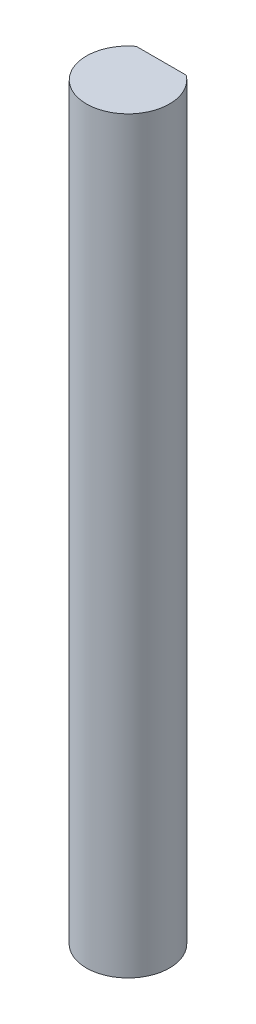
ISO-10303-21;
HEADER;
FILE_DESCRIPTION(('STEP AP214'),'2;1');
FILE_NAME('part.step','',(''),(''),'','','');
FILE_SCHEMA(('AUTOMOTIVE_DESIGN { 1 0 10303 214 1 1 1 1 }'));
ENDSEC;
DATA;
#1=APPLICATION_CONTEXT('core data for automotive mechanical design processes');
#2=APPLICATION_PROTOCOL_DEFINITION('international standard','automotive_design',2000,#1);
#3=PRODUCT_CONTEXT('',#1,'mechanical');
#4=PRODUCT('Part','Part','',(#3));
#5=PRODUCT_RELATED_PRODUCT_CATEGORY('part','',(#4));
#6=PRODUCT_DEFINITION_FORMATION('','',#4);
#7=PRODUCT_DEFINITION_CONTEXT('part definition',#1,'design');
#8=PRODUCT_DEFINITION('design','',#6,#7);
#9=PRODUCT_DEFINITION_SHAPE('','',#8);
#10=(LENGTH_UNIT() NAMED_UNIT(*) SI_UNIT(.MILLI.,.METRE.));
#11=(NAMED_UNIT(*) PLANE_ANGLE_UNIT() SI_UNIT($,.RADIAN.));
#12=(NAMED_UNIT(*) SI_UNIT($,.STERADIAN.) SOLID_ANGLE_UNIT());
#13=UNCERTAINTY_MEASURE_WITH_UNIT(LENGTH_MEASURE(1.E-05),#10,'distance_accuracy_value','');
#14=(GEOMETRIC_REPRESENTATION_CONTEXT(3) GLOBAL_UNCERTAINTY_ASSIGNED_CONTEXT((#13)) GLOBAL_UNIT_ASSIGNED_CONTEXT((#10,
#11,#12)) REPRESENTATION_CONTEXT('',''));
#15=CARTESIAN_POINT('',(0.,0.,0.));
#16=DIRECTION('',(0.,0.,1.));
#17=DIRECTION('',(1.,0.,0.));
#18=AXIS2_PLACEMENT_3D('',#15,#16,#17);
#19=CARTESIAN_POINT('',(0.,45.,0.));
#20=DIRECTION('',(0.,-1.,0.));
#21=DIRECTION('',(0.,0.,-1.));
#22=AXIS2_PLACEMENT_3D('',#19,#20,#21);
#23=CYLINDRICAL_SURFACE('',#22,2.5);
#24=CARTESIAN_POINT('',(0.,0.,0.));
#25=DIRECTION('',(0.,1.,0.));
#26=DIRECTION('',(0.,0.,1.));
#27=AXIS2_PLACEMENT_3D('',#24,#25,#26);
#28=CIRCLE('',#27,2.5);
#29=CARTESIAN_POINT('',(-1.5,0.,-2.));
#30=VERTEX_POINT('',#29);
#31=CARTESIAN_POINT('',(1.5,0.,-2.));
#32=VERTEX_POINT('',#31);
#33=EDGE_CURVE('E72',#30,#32,#28,.T.);
#34=ORIENTED_EDGE('',*,*,#33,.T.);
#35=DIRECTION('',(0.,-1.,0.));
#36=VECTOR('',#35,1.);
#37=CARTESIAN_POINT('',(1.5,45.,-2.));
#38=LINE('',#37,#36);
#39=CARTESIAN_POINT('',(1.5,45.,-2.));
#40=VERTEX_POINT('',#39);
#41=EDGE_CURVE('E11',#40,#32,#38,.T.);
#42=ORIENTED_EDGE('',*,*,#41,.F.);
#43=CARTESIAN_POINT('',(0.,45.,0.));
#44=DIRECTION('',(0.,1.,0.));
#45=DIRECTION('',(0.,0.,1.));
#46=AXIS2_PLACEMENT_3D('',#43,#44,#45);
#47=CIRCLE('',#46,2.5);
#48=CARTESIAN_POINT('',(-1.5,45.,-2.));
#49=VERTEX_POINT('',#48);
#50=EDGE_CURVE('E74',#49,#40,#47,.T.);
#51=ORIENTED_EDGE('',*,*,#50,.F.);
#52=DIRECTION('',(0.,-1.,0.));
#53=VECTOR('',#52,1.);
#54=CARTESIAN_POINT('',(-1.5,45.,-2.));
#55=LINE('',#54,#53);
#56=EDGE_CURVE('E56',#49,#30,#55,.T.);
#57=ORIENTED_EDGE('',*,*,#56,.T.);
#58=EDGE_LOOP('',(#34,#42,#51,#57));
#59=FACE_BOUND('',#58,.T.);
#60=ADVANCED_FACE('F47',(#59),#23,.T.);
#61=CARTESIAN_POINT('',(0.,45.,-2.));
#62=DIRECTION('',(0.,0.,-1.));
#63=DIRECTION('',(-1.,0.,0.));
#64=AXIS2_PLACEMENT_3D('',#61,#62,#63);
#65=PLANE('',#64);
#66=DIRECTION('',(1.,0.,0.));
#67=VECTOR('',#66,1.);
#68=CARTESIAN_POINT('',(0.,0.,-2.));
#69=LINE('',#68,#67);
#70=EDGE_CURVE('E80',#30,#32,#69,.T.);
#71=ORIENTED_EDGE('',*,*,#70,.F.);
#72=ORIENTED_EDGE('',*,*,#56,.F.);
#73=DIRECTION('',(1.,0.,0.));
#74=VECTOR('',#73,1.);
#75=CARTESIAN_POINT('',(0.,45.,-2.));
#76=LINE('',#75,#74);
#77=EDGE_CURVE('E77',#49,#40,#76,.T.);
#78=ORIENTED_EDGE('',*,*,#77,.T.);
#79=ORIENTED_EDGE('',*,*,#41,.T.);
#80=EDGE_LOOP('',(#71,#72,#78,#79));
#81=FACE_BOUND('',#80,.T.);
#82=ADVANCED_FACE('F83',(#81),#65,.T.);
#83=CARTESIAN_POINT('',(0.,45.,0.));
#84=DIRECTION('',(0.,1.,0.));
#85=DIRECTION('',(0.,0.,1.));
#86=AXIS2_PLACEMENT_3D('',#83,#84,#85);
#87=PLANE('',#86);
#88=ORIENTED_EDGE('',*,*,#50,.T.);
#89=ORIENTED_EDGE('',*,*,#77,.F.);
#90=EDGE_LOOP('',(#88,#89));
#91=FACE_BOUND('',#90,.T.);
#92=ADVANCED_FACE('F91',(#91),#87,.T.);
#93=CARTESIAN_POINT('',(0.,0.,0.));
#94=DIRECTION('',(0.,1.,0.));
#95=DIRECTION('',(0.,0.,1.));
#96=AXIS2_PLACEMENT_3D('',#93,#94,#95);
#97=PLANE('',#96);
#98=ORIENTED_EDGE('',*,*,#33,.F.);
#99=ORIENTED_EDGE('',*,*,#70,.T.);
#100=EDGE_LOOP('',(#98,#99));
#101=FACE_BOUND('',#100,.T.);
#102=ADVANCED_FACE('F79',(#101),#97,.F.);
#103=CLOSED_SHELL('',(#60,#82,#92,#102));
#104=MANIFOLD_SOLID_BREP('B2',#103);
#105=ADVANCED_BREP_SHAPE_REPRESENTATION('',(#18,#104),#14);
#106=SHAPE_DEFINITION_REPRESENTATION(#9,#105);
ENDSEC;
END-ISO-10303-21;
